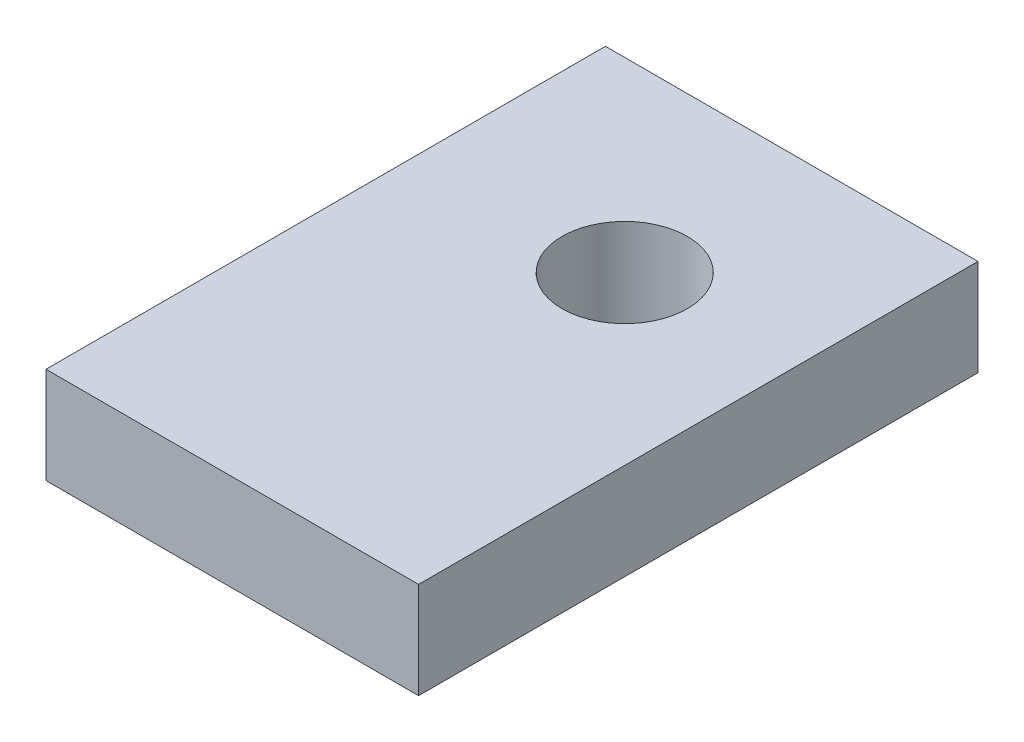
ISO-10303-21;
HEADER;
FILE_DESCRIPTION(('STEP AP214'),'2;1');
FILE_NAME('part.step','',(''),(''),'','','');
FILE_SCHEMA(('AUTOMOTIVE_DESIGN { 1 0 10303 214 1 1 1 1 }'));
ENDSEC;
DATA;
#1=APPLICATION_CONTEXT('core data for automotive mechanical design processes');
#2=APPLICATION_PROTOCOL_DEFINITION('international standard','automotive_design',2000,#1);
#3=PRODUCT_CONTEXT('',#1,'mechanical');
#4=PRODUCT('Part','Part','',(#3));
#5=PRODUCT_RELATED_PRODUCT_CATEGORY('part','',(#4));
#6=PRODUCT_DEFINITION_FORMATION('','',#4);
#7=PRODUCT_DEFINITION_CONTEXT('part definition',#1,'design');
#8=PRODUCT_DEFINITION('design','',#6,#7);
#9=PRODUCT_DEFINITION_SHAPE('','',#8);
#10=(LENGTH_UNIT() NAMED_UNIT(*) SI_UNIT(.MILLI.,.METRE.));
#11=(NAMED_UNIT(*) PLANE_ANGLE_UNIT() SI_UNIT($,.RADIAN.));
#12=(NAMED_UNIT(*) SI_UNIT($,.STERADIAN.) SOLID_ANGLE_UNIT());
#13=UNCERTAINTY_MEASURE_WITH_UNIT(LENGTH_MEASURE(1.E-05),#10,'distance_accuracy_value','');
#14=(GEOMETRIC_REPRESENTATION_CONTEXT(3) GLOBAL_UNCERTAINTY_ASSIGNED_CONTEXT((#13)) GLOBAL_UNIT_ASSIGNED_CONTEXT((#10,
#11,#12)) REPRESENTATION_CONTEXT('',''));
#15=CARTESIAN_POINT('',(0.,0.,0.));
#16=DIRECTION('',(0.,0.,1.));
#17=DIRECTION('',(1.,0.,0.));
#18=AXIS2_PLACEMENT_3D('',#15,#16,#17);
#19=CARTESIAN_POINT('',(0.,6.35,0.));
#20=DIRECTION('',(0.,1.,0.));
#21=DIRECTION('',(0.,0.,1.));
#22=AXIS2_PLACEMENT_3D('',#19,#20,#21);
#23=PLANE('',#22);
#24=DIRECTION('',(-1.,0.,0.));
#25=VECTOR('',#24,1.);
#26=CARTESIAN_POINT('',(-1.22514845490862E-13,6.35,0.));
#27=LINE('',#26,#25);
#28=CARTESIAN_POINT('',(24.5399999419997,6.35,0.));
#29=VERTEX_POINT('',#28);
#30=CARTESIAN_POINT('',(-1.22514845490862E-13,6.35,0.));
#31=VERTEX_POINT('',#30);
#32=EDGE_CURVE('E91',#29,#31,#27,.T.);
#33=ORIENTED_EDGE('',*,*,#32,.T.);
#34=DIRECTION('',(0.,0.,1.));
#35=VECTOR('',#34,1.);
#36=CARTESIAN_POINT('',(-1.22514845490862E-13,6.35,0.));
#37=LINE('',#36,#35);
#38=CARTESIAN_POINT('',(0.,6.35,36.845));
#39=VERTEX_POINT('',#38);
#40=EDGE_CURVE('E86',#31,#39,#37,.T.);
#41=ORIENTED_EDGE('',*,*,#40,.T.);
#42=DIRECTION('',(1.,0.,0.));
#43=VECTOR('',#42,1.);
#44=CARTESIAN_POINT('',(0.,6.35,36.845));
#45=LINE('',#44,#43);
#46=CARTESIAN_POINT('',(24.5399999419997,6.35,36.845));
#47=VERTEX_POINT('',#46);
#48=EDGE_CURVE('E89',#39,#47,#45,.T.);
#49=ORIENTED_EDGE('',*,*,#48,.T.);
#50=DIRECTION('',(0.,0.,-1.));
#51=VECTOR('',#50,1.);
#52=CARTESIAN_POINT('',(24.5399999419997,6.35,36.845));
#53=LINE('',#52,#51);
#54=EDGE_CURVE('E56',#47,#29,#53,.T.);
#55=ORIENTED_EDGE('',*,*,#54,.T.);
#56=EDGE_LOOP('',(#33,#41,#49,#55));
#57=FACE_BOUND('',#56,.T.);
#58=CARTESIAN_POINT('',(13.54,6.35,12.27));
#59=DIRECTION('',(0.,1.,0.));
#60=DIRECTION('',(0.,0.,1.));
#61=AXIS2_PLACEMENT_3D('',#58,#59,#60);
#62=CIRCLE('',#61,4.127);
#63=CARTESIAN_POINT('',(13.54,6.35,16.397));
#64=VERTEX_POINT('',#63);
#65=EDGE_CURVE('E106',#64,#64,#62,.T.);
#66=ORIENTED_EDGE('',*,*,#65,.F.);
#67=EDGE_LOOP('',(#66));
#68=FACE_BOUND('',#67,.T.);
#69=ADVANCED_FACE('F39',(#57,#68),#23,.T.);
#70=CARTESIAN_POINT('',(0.,0.,0.));
#71=DIRECTION('',(0.,1.,0.));
#72=DIRECTION('',(0.,0.,1.));
#73=AXIS2_PLACEMENT_3D('',#70,#71,#72);
#74=PLANE('',#73);
#75=DIRECTION('',(-1.,0.,0.));
#76=VECTOR('',#75,1.);
#77=CARTESIAN_POINT('',(-1.22514845490862E-13,0.,0.));
#78=LINE('',#77,#76);
#79=CARTESIAN_POINT('',(24.5399999419997,0.,0.));
#80=VERTEX_POINT('',#79);
#81=CARTESIAN_POINT('',(-1.22514845490862E-13,0.,0.));
#82=VERTEX_POINT('',#81);
#83=EDGE_CURVE('E103',#80,#82,#78,.T.);
#84=ORIENTED_EDGE('',*,*,#83,.F.);
#85=DIRECTION('',(0.,0.,-1.));
#86=VECTOR('',#85,1.);
#87=CARTESIAN_POINT('',(24.5399999419997,0.,36.845));
#88=LINE('',#87,#86);
#89=CARTESIAN_POINT('',(24.5399999419997,0.,36.845));
#90=VERTEX_POINT('',#89);
#91=EDGE_CURVE('E79',#90,#80,#88,.T.);
#92=ORIENTED_EDGE('',*,*,#91,.F.);
#93=DIRECTION('',(1.,0.,0.));
#94=VECTOR('',#93,1.);
#95=CARTESIAN_POINT('',(0.,0.,36.845));
#96=LINE('',#95,#94);
#97=CARTESIAN_POINT('',(0.,0.,36.845));
#98=VERTEX_POINT('',#97);
#99=EDGE_CURVE('E73',#98,#90,#96,.T.);
#100=ORIENTED_EDGE('',*,*,#99,.F.);
#101=DIRECTION('',(0.,0.,1.));
#102=VECTOR('',#101,1.);
#103=CARTESIAN_POINT('',(-1.22514845490862E-13,0.,0.));
#104=LINE('',#103,#102);
#105=EDGE_CURVE('E95',#82,#98,#104,.T.);
#106=ORIENTED_EDGE('',*,*,#105,.F.);
#107=EDGE_LOOP('',(#84,#92,#100,#106));
#108=FACE_BOUND('',#107,.T.);
#109=CARTESIAN_POINT('',(13.54,0.,12.27));
#110=DIRECTION('',(0.,1.,0.));
#111=DIRECTION('',(0.,0.,1.));
#112=AXIS2_PLACEMENT_3D('',#109,#110,#111);
#113=CIRCLE('',#112,4.127);
#114=CARTESIAN_POINT('',(13.54,0.,16.397));
#115=VERTEX_POINT('',#114);
#116=EDGE_CURVE('E118',#115,#115,#113,.T.);
#117=ORIENTED_EDGE('',*,*,#116,.T.);
#118=EDGE_LOOP('',(#117));
#119=FACE_BOUND('',#118,.T.);
#120=ADVANCED_FACE('F114',(#108,#119),#74,.F.);
#121=CARTESIAN_POINT('',(-1.22514845490862E-13,6.35,0.));
#122=DIRECTION('',(0.,0.,1.));
#123=DIRECTION('',(1.,0.,0.));
#124=AXIS2_PLACEMENT_3D('',#121,#122,#123);
#125=PLANE('',#124);
#126=ORIENTED_EDGE('',*,*,#83,.T.);
#127=DIRECTION('',(0.,-1.,0.));
#128=VECTOR('',#127,1.);
#129=CARTESIAN_POINT('',(-1.22514845490862E-13,6.35,0.));
#130=LINE('',#129,#128);
#131=EDGE_CURVE('E11',#31,#82,#130,.T.);
#132=ORIENTED_EDGE('',*,*,#131,.F.);
#133=ORIENTED_EDGE('',*,*,#32,.F.);
#134=DIRECTION('',(0.,-1.,0.));
#135=VECTOR('',#134,1.);
#136=CARTESIAN_POINT('',(24.5399999419997,6.35,0.));
#137=LINE('',#136,#135);
#138=EDGE_CURVE('E99',#29,#80,#137,.T.);
#139=ORIENTED_EDGE('',*,*,#138,.T.);
#140=EDGE_LOOP('',(#126,#132,#133,#139));
#141=FACE_BOUND('',#140,.T.);
#142=ADVANCED_FACE('F41',(#141),#125,.F.);
#143=CARTESIAN_POINT('',(-1.22514845490862E-13,6.35,0.));
#144=DIRECTION('',(1.,0.,0.));
#145=DIRECTION('',(0.,0.,-1.));
#146=AXIS2_PLACEMENT_3D('',#143,#144,#145);
#147=PLANE('',#146);
#148=ORIENTED_EDGE('',*,*,#105,.T.);
#149=DIRECTION('',(0.,-1.,0.));
#150=VECTOR('',#149,1.);
#151=CARTESIAN_POINT('',(0.,6.35,36.845));
#152=LINE('',#151,#150);
#153=EDGE_CURVE('E48',#39,#98,#152,.T.);
#154=ORIENTED_EDGE('',*,*,#153,.F.);
#155=ORIENTED_EDGE('',*,*,#40,.F.);
#156=ORIENTED_EDGE('',*,*,#131,.T.);
#157=EDGE_LOOP('',(#148,#154,#155,#156));
#158=FACE_BOUND('',#157,.T.);
#159=ADVANCED_FACE('F94',(#158),#147,.F.);
#160=CARTESIAN_POINT('',(0.,6.35,36.845));
#161=DIRECTION('',(0.,0.,-1.));
#162=DIRECTION('',(-1.,0.,0.));
#163=AXIS2_PLACEMENT_3D('',#160,#161,#162);
#164=PLANE('',#163);
#165=ORIENTED_EDGE('',*,*,#99,.T.);
#166=DIRECTION('',(0.,-1.,0.));
#167=VECTOR('',#166,1.);
#168=CARTESIAN_POINT('',(24.5399999419997,6.35,36.845));
#169=LINE('',#168,#167);
#170=EDGE_CURVE('E96',#47,#90,#169,.T.);
#171=ORIENTED_EDGE('',*,*,#170,.F.);
#172=ORIENTED_EDGE('',*,*,#48,.F.);
#173=ORIENTED_EDGE('',*,*,#153,.T.);
#174=EDGE_LOOP('',(#165,#171,#172,#173));
#175=FACE_BOUND('',#174,.T.);
#176=ADVANCED_FACE('F97',(#175),#164,.F.);
#177=CARTESIAN_POINT('',(24.5399999419997,6.35,36.845));
#178=DIRECTION('',(-1.,0.,0.));
#179=DIRECTION('',(0.,0.,1.));
#180=AXIS2_PLACEMENT_3D('',#177,#178,#179);
#181=PLANE('',#180);
#182=ORIENTED_EDGE('',*,*,#91,.T.);
#183=ORIENTED_EDGE('',*,*,#138,.F.);
#184=ORIENTED_EDGE('',*,*,#54,.F.);
#185=ORIENTED_EDGE('',*,*,#170,.T.);
#186=EDGE_LOOP('',(#182,#183,#184,#185));
#187=FACE_BOUND('',#186,.T.);
#188=ADVANCED_FACE('F111',(#187),#181,.F.);
#189=CARTESIAN_POINT('',(13.54,6.35,12.27));
#190=DIRECTION('',(0.,-1.,0.));
#191=DIRECTION('',(0.,0.,-1.));
#192=AXIS2_PLACEMENT_3D('',#189,#190,#191);
#193=CYLINDRICAL_SURFACE('',#192,4.127);
#194=ORIENTED_EDGE('',*,*,#65,.T.);
#195=EDGE_LOOP('',(#194));
#196=FACE_BOUND('',#195,.T.);
#197=ORIENTED_EDGE('',*,*,#116,.F.);
#198=EDGE_LOOP('',(#197));
#199=FACE_BOUND('',#198,.T.);
#200=ADVANCED_FACE('F124',(#196,#199),#193,.F.);
#201=CLOSED_SHELL('',(#69,#120,#142,#159,#176,#188,#200));
#202=MANIFOLD_SOLID_BREP('B2',#201);
#203=ADVANCED_BREP_SHAPE_REPRESENTATION('',(#18,#202),#14);
#204=SHAPE_DEFINITION_REPRESENTATION(#9,#203);
ENDSEC;
END-ISO-10303-21;
